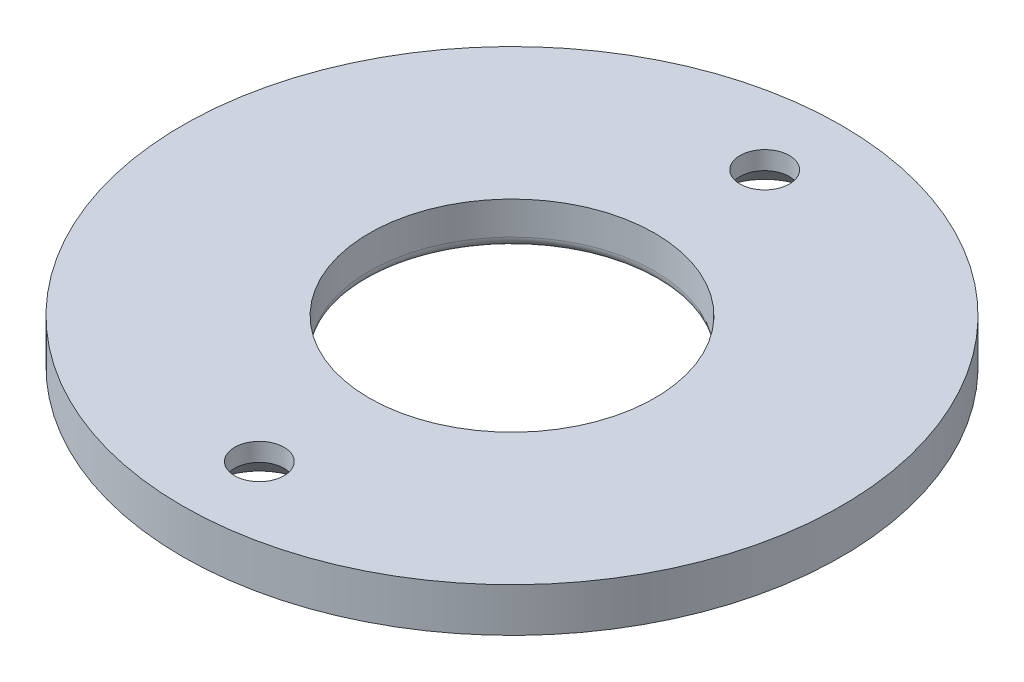
ISO-10303-21;
HEADER;
FILE_DESCRIPTION(('STEP AP214'),'2;1');
FILE_NAME('part.step','',(''),(''),'','','');
FILE_SCHEMA(('AUTOMOTIVE_DESIGN { 1 0 10303 214 1 1 1 1 }'));
ENDSEC;
DATA;
#1=APPLICATION_CONTEXT('core data for automotive mechanical design processes');
#2=APPLICATION_PROTOCOL_DEFINITION('international standard','automotive_design',2000,#1);
#3=PRODUCT_CONTEXT('',#1,'mechanical');
#4=PRODUCT('Part','Part','',(#3));
#5=PRODUCT_RELATED_PRODUCT_CATEGORY('part','',(#4));
#6=PRODUCT_DEFINITION_FORMATION('','',#4);
#7=PRODUCT_DEFINITION_CONTEXT('part definition',#1,'design');
#8=PRODUCT_DEFINITION('design','',#6,#7);
#9=PRODUCT_DEFINITION_SHAPE('','',#8);
#10=(LENGTH_UNIT() NAMED_UNIT(*) SI_UNIT(.MILLI.,.METRE.));
#11=(NAMED_UNIT(*) PLANE_ANGLE_UNIT() SI_UNIT($,.RADIAN.));
#12=(NAMED_UNIT(*) SI_UNIT($,.STERADIAN.) SOLID_ANGLE_UNIT());
#13=UNCERTAINTY_MEASURE_WITH_UNIT(LENGTH_MEASURE(1.E-05),#10,'distance_accuracy_value','');
#14=(GEOMETRIC_REPRESENTATION_CONTEXT(3) GLOBAL_UNCERTAINTY_ASSIGNED_CONTEXT((#13)) GLOBAL_UNIT_ASSIGNED_CONTEXT((#10,
#11,#12)) REPRESENTATION_CONTEXT('',''));
#15=CARTESIAN_POINT('',(0.,0.,0.));
#16=DIRECTION('',(0.,0.,1.));
#17=DIRECTION('',(1.,0.,0.));
#18=AXIS2_PLACEMENT_3D('',#15,#16,#17);
#19=CARTESIAN_POINT('',(0.,55.,0.));
#20=DIRECTION('',(0.,1.,0.));
#21=DIRECTION('',(0.,0.,1.));
#22=AXIS2_PLACEMENT_3D('',#19,#20,#21);
#23=CYLINDRICAL_SURFACE('',#22,13.);
#24=CARTESIAN_POINT('',(0.,-1.,0.));
#25=DIRECTION('',(0.,-1.,0.));
#26=DIRECTION('',(0.,0.,-1.));
#27=AXIS2_PLACEMENT_3D('',#24,#25,#26);
#28=CIRCLE('',#27,13.);
#29=CARTESIAN_POINT('',(0.,-1.,-13.));
#30=VERTEX_POINT('',#29);
#31=EDGE_CURVE('E10',#30,#30,#28,.T.);
#32=ORIENTED_EDGE('',*,*,#31,.T.);
#33=EDGE_LOOP('',(#32));
#34=FACE_BOUND('',#33,.T.);
#35=CARTESIAN_POINT('',(0.,2.,0.));
#36=DIRECTION('',(0.,1.,0.));
#37=DIRECTION('',(0.,0.,1.));
#38=AXIS2_PLACEMENT_3D('',#35,#36,#37);
#39=CIRCLE('',#38,13.);
#40=CARTESIAN_POINT('',(0.,2.,13.));
#41=VERTEX_POINT('',#40);
#42=EDGE_CURVE('E45',#41,#41,#39,.T.);
#43=ORIENTED_EDGE('',*,*,#42,.T.);
#44=EDGE_LOOP('',(#43));
#45=FACE_BOUND('',#44,.T.);
#46=ADVANCED_FACE('F41',(#34,#45),#23,.F.);
#47=CARTESIAN_POINT('',(-30.,2.,0.));
#48=DIRECTION('',(0.,1.,0.));
#49=DIRECTION('',(0.,0.,1.));
#50=AXIS2_PLACEMENT_3D('',#47,#48,#49);
#51=PLANE('',#50);
#52=CARTESIAN_POINT('',(0.,2.,-23.));
#53=DIRECTION('',(0.,1.,0.));
#54=DIRECTION('',(0.,0.,1.));
#55=AXIS2_PLACEMENT_3D('',#52,#53,#54);
#56=CIRCLE('',#55,2.25);
#57=CARTESIAN_POINT('',(0.,2.,-20.75));
#58=VERTEX_POINT('',#57);
#59=EDGE_CURVE('E77',#58,#58,#56,.T.);
#60=ORIENTED_EDGE('',*,*,#59,.F.);
#61=EDGE_LOOP('',(#60));
#62=FACE_BOUND('',#61,.T.);
#63=CARTESIAN_POINT('',(0.,2.,23.));
#64=DIRECTION('',(0.,1.,0.));
#65=DIRECTION('',(0.,0.,1.));
#66=AXIS2_PLACEMENT_3D('',#63,#64,#65);
#67=CIRCLE('',#66,2.25);
#68=CARTESIAN_POINT('',(0.,2.,25.25));
#69=VERTEX_POINT('',#68);
#70=EDGE_CURVE('E65',#69,#69,#67,.T.);
#71=ORIENTED_EDGE('',*,*,#70,.F.);
#72=EDGE_LOOP('',(#71));
#73=FACE_BOUND('',#72,.T.);
#74=CARTESIAN_POINT('',(0.,2.,0.));
#75=DIRECTION('',(0.,1.,0.));
#76=DIRECTION('',(0.,0.,1.));
#77=AXIS2_PLACEMENT_3D('',#74,#75,#76);
#78=CIRCLE('',#77,30.);
#79=CARTESIAN_POINT('',(0.,2.,30.));
#80=VERTEX_POINT('',#79);
#81=EDGE_CURVE('E55',#80,#80,#78,.T.);
#82=ORIENTED_EDGE('',*,*,#81,.T.);
#83=EDGE_LOOP('',(#82));
#84=FACE_BOUND('',#83,.T.);
#85=ORIENTED_EDGE('',*,*,#42,.F.);
#86=EDGE_LOOP('',(#85));
#87=FACE_BOUND('',#86,.T.);
#88=ADVANCED_FACE('F95',(#62,#73,#84,#87),#51,.T.);
#89=CARTESIAN_POINT('',(0.,55.,0.));
#90=DIRECTION('',(0.,1.,0.));
#91=DIRECTION('',(0.,0.,1.));
#92=AXIS2_PLACEMENT_3D('',#89,#90,#91);
#93=CYLINDRICAL_SURFACE('',#92,30.);
#94=CARTESIAN_POINT('',(0.,-2.,0.));
#95=DIRECTION('',(0.,1.,0.));
#96=DIRECTION('',(0.,0.,1.));
#97=AXIS2_PLACEMENT_3D('',#94,#95,#96);
#98=CIRCLE('',#97,30.);
#99=CARTESIAN_POINT('',(0.,-2.,30.));
#100=VERTEX_POINT('',#99);
#101=EDGE_CURVE('E61',#100,#100,#98,.T.);
#102=ORIENTED_EDGE('',*,*,#101,.T.);
#103=EDGE_LOOP('',(#102));
#104=FACE_BOUND('',#103,.T.);
#105=ORIENTED_EDGE('',*,*,#81,.F.);
#106=EDGE_LOOP('',(#105));
#107=FACE_BOUND('',#106,.T.);
#108=ADVANCED_FACE('F97',(#104,#107),#93,.T.);
#109=CARTESIAN_POINT('',(-13.,-2.,0.));
#110=DIRECTION('',(0.,-1.,0.));
#111=DIRECTION('',(0.,0.,-1.));
#112=AXIS2_PLACEMENT_3D('',#109,#110,#111);
#113=PLANE('',#112);
#114=CARTESIAN_POINT('',(0.,-2.,0.));
#115=DIRECTION('',(0.,-1.,0.));
#116=DIRECTION('',(0.,0.,-1.));
#117=AXIS2_PLACEMENT_3D('',#114,#115,#116);
#118=CIRCLE('',#117,14.);
#119=CARTESIAN_POINT('',(0.,-2.,-14.));
#120=VERTEX_POINT('',#119);
#121=EDGE_CURVE('E50',#120,#120,#118,.F.);
#122=ORIENTED_EDGE('',*,*,#121,.T.);
#123=EDGE_LOOP('',(#122));
#124=FACE_BOUND('',#123,.T.);
#125=CARTESIAN_POINT('',(0.,-2.,-23.));
#126=DIRECTION('',(0.,-1.,0.));
#127=DIRECTION('',(0.,0.,-1.));
#128=AXIS2_PLACEMENT_3D('',#125,#126,#127);
#129=CIRCLE('',#128,4.59);
#130=CARTESIAN_POINT('',(0.,-2.,-27.59));
#131=VERTEX_POINT('',#130);
#132=EDGE_CURVE('E85',#131,#131,#129,.T.);
#133=ORIENTED_EDGE('',*,*,#132,.F.);
#134=EDGE_LOOP('',(#133));
#135=FACE_BOUND('',#134,.T.);
#136=CARTESIAN_POINT('',(0.,-2.,23.));
#137=DIRECTION('',(0.,-1.,0.));
#138=DIRECTION('',(0.,0.,-1.));
#139=AXIS2_PLACEMENT_3D('',#136,#137,#138);
#140=CIRCLE('',#139,4.59);
#141=CARTESIAN_POINT('',(0.,-2.,18.41));
#142=VERTEX_POINT('',#141);
#143=EDGE_CURVE('E73',#142,#142,#140,.T.);
#144=ORIENTED_EDGE('',*,*,#143,.F.);
#145=EDGE_LOOP('',(#144));
#146=FACE_BOUND('',#145,.T.);
#147=ORIENTED_EDGE('',*,*,#101,.F.);
#148=EDGE_LOOP('',(#147));
#149=FACE_BOUND('',#148,.T.);
#150=ADVANCED_FACE('F103',(#124,#135,#146,#149),#113,.T.);
#151=CARTESIAN_POINT('',(0.,-2.,23.));
#152=DIRECTION('',(0.,-1.,0.));
#153=DIRECTION('',(0.,0.,-1.));
#154=AXIS2_PLACEMENT_3D('',#151,#152,#153);
#155=CYLINDRICAL_SURFACE('',#154,2.25);
#156=CARTESIAN_POINT('',(0.,0.34,23.));
#157=DIRECTION('',(0.,-1.,0.));
#158=DIRECTION('',(0.,0.,-1.));
#159=AXIS2_PLACEMENT_3D('',#156,#157,#158);
#160=CIRCLE('',#159,2.25);
#161=CARTESIAN_POINT('',(0.,0.34,20.75));
#162=VERTEX_POINT('',#161);
#163=EDGE_CURVE('E69',#162,#162,#160,.T.);
#164=ORIENTED_EDGE('',*,*,#163,.T.);
#165=EDGE_LOOP('',(#164));
#166=FACE_BOUND('',#165,.T.);
#167=ORIENTED_EDGE('',*,*,#70,.T.);
#168=EDGE_LOOP('',(#167));
#169=FACE_BOUND('',#168,.T.);
#170=ADVANCED_FACE('F111',(#166,#169),#155,.F.);
#171=CARTESIAN_POINT('',(0.,-2.,23.));
#172=DIRECTION('',(0.,-1.,0.));
#173=DIRECTION('',(0.,0.,-1.));
#174=AXIS2_PLACEMENT_3D('',#171,#172,#173);
#175=CONICAL_SURFACE('',#174,4.59,0.785398163397448);
#176=ORIENTED_EDGE('',*,*,#163,.F.);
#177=EDGE_LOOP('',(#176));
#178=FACE_BOUND('',#177,.T.);
#179=ORIENTED_EDGE('',*,*,#143,.T.);
#180=EDGE_LOOP('',(#179));
#181=FACE_BOUND('',#180,.T.);
#182=ADVANCED_FACE('F116',(#178,#181),#175,.F.);
#183=CARTESIAN_POINT('',(0.,-2.,-23.));
#184=DIRECTION('',(0.,-1.,0.));
#185=DIRECTION('',(0.,0.,-1.));
#186=AXIS2_PLACEMENT_3D('',#183,#184,#185);
#187=CYLINDRICAL_SURFACE('',#186,2.25);
#188=CARTESIAN_POINT('',(0.,0.34,-23.));
#189=DIRECTION('',(0.,-1.,0.));
#190=DIRECTION('',(0.,0.,-1.));
#191=AXIS2_PLACEMENT_3D('',#188,#189,#190);
#192=CIRCLE('',#191,2.25);
#193=CARTESIAN_POINT('',(0.,0.34,-25.25));
#194=VERTEX_POINT('',#193);
#195=EDGE_CURVE('E81',#194,#194,#192,.T.);
#196=ORIENTED_EDGE('',*,*,#195,.T.);
#197=EDGE_LOOP('',(#196));
#198=FACE_BOUND('',#197,.T.);
#199=ORIENTED_EDGE('',*,*,#59,.T.);
#200=EDGE_LOOP('',(#199));
#201=FACE_BOUND('',#200,.T.);
#202=ADVANCED_FACE('F120',(#198,#201),#187,.F.);
#203=CARTESIAN_POINT('',(0.,-2.,-23.));
#204=DIRECTION('',(0.,-1.,0.));
#205=DIRECTION('',(0.,0.,-1.));
#206=AXIS2_PLACEMENT_3D('',#203,#204,#205);
#207=CONICAL_SURFACE('',#206,4.59,0.785398163397448);
#208=ORIENTED_EDGE('',*,*,#195,.F.);
#209=EDGE_LOOP('',(#208));
#210=FACE_BOUND('',#209,.T.);
#211=ORIENTED_EDGE('',*,*,#132,.T.);
#212=EDGE_LOOP('',(#211));
#213=FACE_BOUND('',#212,.T.);
#214=ADVANCED_FACE('F124',(#210,#213),#207,.F.);
#215=CARTESIAN_POINT('',(0.,-1.,0.));
#216=DIRECTION('',(0.,-1.,0.));
#217=DIRECTION('',(0.,0.,-1.));
#218=AXIS2_PLACEMENT_3D('',#215,#216,#217);
#219=TOROIDAL_SURFACE('',#218,14.,1.);
#220=ORIENTED_EDGE('',*,*,#31,.F.);
#221=EDGE_LOOP('',(#220));
#222=FACE_BOUND('',#221,.T.);
#223=ORIENTED_EDGE('',*,*,#121,.F.);
#224=EDGE_LOOP('',(#223));
#225=FACE_BOUND('',#224,.T.);
#226=ADVANCED_FACE('F43',(#222,#225),#219,.T.);
#227=CLOSED_SHELL('',(#46,#88,#108,#150,#170,#182,#202,#214,#226));
#228=MANIFOLD_SOLID_BREP('B2',#227);
#229=ADVANCED_BREP_SHAPE_REPRESENTATION('',(#18,#228),#14);
#230=SHAPE_DEFINITION_REPRESENTATION(#9,#229);
ENDSEC;
END-ISO-10303-21;
